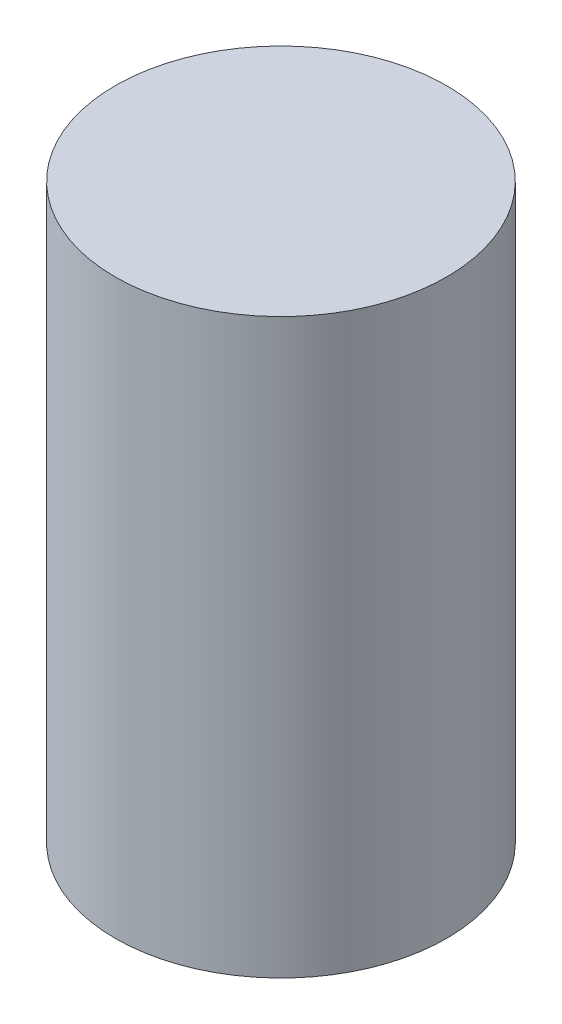
ISO-10303-21;
HEADER;
FILE_DESCRIPTION(('STEP AP214'),'2;1');
FILE_NAME('part.step','',(''),(''),'','','');
FILE_SCHEMA(('AUTOMOTIVE_DESIGN { 1 0 10303 214 1 1 1 1 }'));
ENDSEC;
DATA;
#1=APPLICATION_CONTEXT('core data for automotive mechanical design processes');
#2=APPLICATION_PROTOCOL_DEFINITION('international standard','automotive_design',2000,#1);
#3=PRODUCT_CONTEXT('',#1,'mechanical');
#4=PRODUCT('Part','Part','',(#3));
#5=PRODUCT_RELATED_PRODUCT_CATEGORY('part','',(#4));
#6=PRODUCT_DEFINITION_FORMATION('','',#4);
#7=PRODUCT_DEFINITION_CONTEXT('part definition',#1,'design');
#8=PRODUCT_DEFINITION('design','',#6,#7);
#9=PRODUCT_DEFINITION_SHAPE('','',#8);
#10=(LENGTH_UNIT() NAMED_UNIT(*) SI_UNIT(.MILLI.,.METRE.));
#11=(NAMED_UNIT(*) PLANE_ANGLE_UNIT() SI_UNIT($,.RADIAN.));
#12=(NAMED_UNIT(*) SI_UNIT($,.STERADIAN.) SOLID_ANGLE_UNIT());
#13=UNCERTAINTY_MEASURE_WITH_UNIT(LENGTH_MEASURE(1.E-05),#10,'distance_accuracy_value','');
#14=(GEOMETRIC_REPRESENTATION_CONTEXT(3) GLOBAL_UNCERTAINTY_ASSIGNED_CONTEXT((#13)) GLOBAL_UNIT_ASSIGNED_CONTEXT((#10,
#11,#12)) REPRESENTATION_CONTEXT('',''));
#15=CARTESIAN_POINT('',(0.,0.,0.));
#16=DIRECTION('',(0.,0.,1.));
#17=DIRECTION('',(1.,0.,0.));
#18=AXIS2_PLACEMENT_3D('',#15,#16,#17);
#19=CARTESIAN_POINT('',(0.,70.,0.));
#20=DIRECTION('',(0.,-1.,0.));
#21=DIRECTION('',(0.,0.,-1.));
#22=AXIS2_PLACEMENT_3D('',#19,#20,#21);
#23=CYLINDRICAL_SURFACE('',#22,20.25);
#24=CARTESIAN_POINT('',(0.,70.,0.));
#25=DIRECTION('',(0.,1.,0.));
#26=DIRECTION('',(0.,0.,1.));
#27=AXIS2_PLACEMENT_3D('',#24,#25,#26);
#28=CIRCLE('',#27,20.25);
#29=CARTESIAN_POINT('',(0.,70.,20.25));
#30=VERTEX_POINT('',#29);
#31=EDGE_CURVE('E10',#30,#30,#28,.T.);
#32=ORIENTED_EDGE('',*,*,#31,.F.);
#33=EDGE_LOOP('',(#32));
#34=FACE_BOUND('',#33,.T.);
#35=CARTESIAN_POINT('',(0.,0.,0.));
#36=DIRECTION('',(0.,1.,0.));
#37=DIRECTION('',(0.,0.,1.));
#38=AXIS2_PLACEMENT_3D('',#35,#36,#37);
#39=CIRCLE('',#38,20.25);
#40=CARTESIAN_POINT('',(0.,0.,20.25));
#41=VERTEX_POINT('',#40);
#42=EDGE_CURVE('E38',#41,#41,#39,.T.);
#43=ORIENTED_EDGE('',*,*,#42,.T.);
#44=EDGE_LOOP('',(#43));
#45=FACE_BOUND('',#44,.T.);
#46=ADVANCED_FACE('F35',(#34,#45),#23,.T.);
#47=CARTESIAN_POINT('',(0.,70.,0.));
#48=DIRECTION('',(0.,1.,0.));
#49=DIRECTION('',(0.,0.,1.));
#50=AXIS2_PLACEMENT_3D('',#47,#48,#49);
#51=PLANE('',#50);
#52=ORIENTED_EDGE('',*,*,#31,.T.);
#53=EDGE_LOOP('',(#52));
#54=FACE_BOUND('',#53,.T.);
#55=ADVANCED_FACE('F50',(#54),#51,.T.);
#56=CARTESIAN_POINT('',(0.,0.,0.));
#57=DIRECTION('',(0.,1.,0.));
#58=DIRECTION('',(0.,0.,1.));
#59=AXIS2_PLACEMENT_3D('',#56,#57,#58);
#60=PLANE('',#59);
#61=ORIENTED_EDGE('',*,*,#42,.F.);
#62=EDGE_LOOP('',(#61));
#63=FACE_BOUND('',#62,.T.);
#64=ADVANCED_FACE('F48',(#63),#60,.F.);
#65=CLOSED_SHELL('',(#46,#55,#64));
#66=MANIFOLD_SOLID_BREP('B2',#65);
#67=ADVANCED_BREP_SHAPE_REPRESENTATION('',(#18,#66),#14);
#68=SHAPE_DEFINITION_REPRESENTATION(#9,#67);
ENDSEC;
END-ISO-10303-21;
